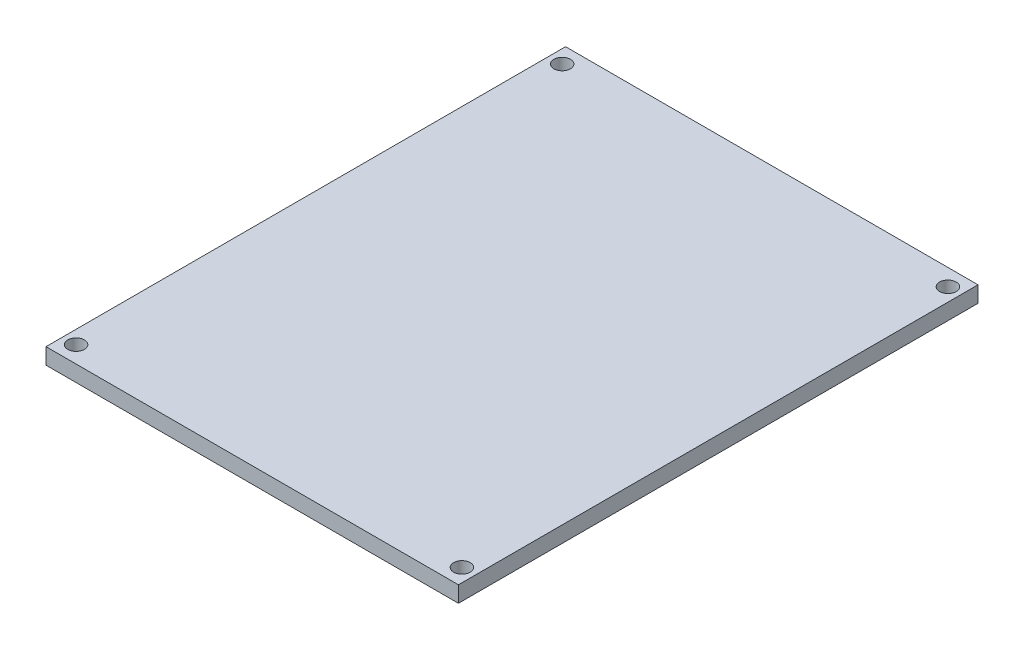
ISO-10303-21;
HEADER;
FILE_DESCRIPTION(('STEP AP214'),'2;1');
FILE_NAME('part.step','',(''),(''),'','','');
FILE_SCHEMA(('AUTOMOTIVE_DESIGN { 1 0 10303 214 1 1 1 1 }'));
ENDSEC;
DATA;
#1=APPLICATION_CONTEXT('core data for automotive mechanical design processes');
#2=APPLICATION_PROTOCOL_DEFINITION('international standard','automotive_design',2000,#1);
#3=PRODUCT_CONTEXT('',#1,'mechanical');
#4=PRODUCT('Part','Part','',(#3));
#5=PRODUCT_RELATED_PRODUCT_CATEGORY('part','',(#4));
#6=PRODUCT_DEFINITION_FORMATION('','',#4);
#7=PRODUCT_DEFINITION_CONTEXT('part definition',#1,'design');
#8=PRODUCT_DEFINITION('design','',#6,#7);
#9=PRODUCT_DEFINITION_SHAPE('','',#8);
#10=(LENGTH_UNIT() NAMED_UNIT(*) SI_UNIT(.MILLI.,.METRE.));
#11=(NAMED_UNIT(*) PLANE_ANGLE_UNIT() SI_UNIT($,.RADIAN.));
#12=(NAMED_UNIT(*) SI_UNIT($,.STERADIAN.) SOLID_ANGLE_UNIT());
#13=UNCERTAINTY_MEASURE_WITH_UNIT(LENGTH_MEASURE(1.E-05),#10,'distance_accuracy_value','');
#14=(GEOMETRIC_REPRESENTATION_CONTEXT(3) GLOBAL_UNCERTAINTY_ASSIGNED_CONTEXT((#13)) GLOBAL_UNIT_ASSIGNED_CONTEXT((#10,
#11,#12)) REPRESENTATION_CONTEXT('',''));
#15=CARTESIAN_POINT('',(0.,0.,0.));
#16=DIRECTION('',(0.,0.,1.));
#17=DIRECTION('',(1.,0.,0.));
#18=AXIS2_PLACEMENT_3D('',#15,#16,#17);
#19=CARTESIAN_POINT('',(0.,3.,0.));
#20=DIRECTION('',(0.,-1.,0.));
#21=DIRECTION('',(0.,0.,-1.));
#22=AXIS2_PLACEMENT_3D('',#19,#20,#21);
#23=PLANE('',#22);
#24=DIRECTION('',(0.,0.,1.));
#25=VECTOR('',#24,1.);
#26=CARTESIAN_POINT('',(-9.83424560929632,3.,5.64017263835992));
#27=LINE('',#26,#25);
#28=CARTESIAN_POINT('',(-9.83424560929632,3.,-91.3598273616401));
#29=VERTEX_POINT('',#28);
#30=CARTESIAN_POINT('',(-9.83424560929632,3.,5.64017263835992));
#31=VERTEX_POINT('',#30);
#32=EDGE_CURVE('E85',#29,#31,#27,.T.);
#33=ORIENTED_EDGE('',*,*,#32,.T.);
#34=DIRECTION('',(1.,0.,0.));
#35=VECTOR('',#34,1.);
#36=CARTESIAN_POINT('',(-9.83424560929632,3.,5.64017263835992));
#37=LINE('',#36,#35);
#38=CARTESIAN_POINT('',(67.1657543907037,3.,5.64017263835992));
#39=VERTEX_POINT('',#38);
#40=EDGE_CURVE('E80',#31,#39,#37,.T.);
#41=ORIENTED_EDGE('',*,*,#40,.T.);
#42=DIRECTION('',(0.,0.,-1.));
#43=VECTOR('',#42,1.);
#44=CARTESIAN_POINT('',(67.1657543907037,3.,5.64017263835992));
#45=LINE('',#44,#43);
#46=CARTESIAN_POINT('',(67.1657543907037,3.,-91.3598273616401));
#47=VERTEX_POINT('',#46);
#48=EDGE_CURVE('E83',#39,#47,#45,.T.);
#49=ORIENTED_EDGE('',*,*,#48,.T.);
#50=DIRECTION('',(-1.,0.,0.));
#51=VECTOR('',#50,1.);
#52=CARTESIAN_POINT('',(-9.83424560929632,3.,-91.3598273616401));
#53=LINE('',#52,#51);
#54=EDGE_CURVE('E50',#47,#29,#53,.T.);
#55=ORIENTED_EDGE('',*,*,#54,.T.);
#56=EDGE_LOOP('',(#33,#41,#49,#55));
#57=FACE_BOUND('',#56,.T.);
#58=CARTESIAN_POINT('',(-7.34729964129647,3.,-88.226921401952));
#59=DIRECTION('',(0.,1.,0.));
#60=DIRECTION('',(0.,0.,1.));
#61=AXIS2_PLACEMENT_3D('',#58,#59,#60);
#62=CIRCLE('',#61,1.54999999999999);
#63=CARTESIAN_POINT('',(-7.34729964129647,3.,-86.676921401952));
#64=VERTEX_POINT('',#63);
#65=EDGE_CURVE('E100',#64,#64,#62,.T.);
#66=ORIENTED_EDGE('',*,*,#65,.F.);
#67=EDGE_LOOP('',(#66));
#68=FACE_BOUND('',#67,.T.);
#69=CARTESIAN_POINT('',(64.6788084227039,3.,-88.226921401952));
#70=DIRECTION('',(0.,1.,0.));
#71=DIRECTION('',(0.,0.,1.));
#72=AXIS2_PLACEMENT_3D('',#69,#70,#71);
#73=CIRCLE('',#72,1.54999999999999);
#74=CARTESIAN_POINT('',(64.6788084227039,3.,-86.676921401952));
#75=VERTEX_POINT('',#74);
#76=EDGE_CURVE('E115',#75,#75,#73,.T.);
#77=ORIENTED_EDGE('',*,*,#76,.F.);
#78=EDGE_LOOP('',(#77));
#79=FACE_BOUND('',#78,.T.);
#80=CARTESIAN_POINT('',(-7.34729964129648,3.,2.5072666786718));
#81=DIRECTION('',(0.,1.,0.));
#82=DIRECTION('',(0.,0.,1.));
#83=AXIS2_PLACEMENT_3D('',#80,#81,#82);
#84=CIRCLE('',#83,1.55);
#85=CARTESIAN_POINT('',(-7.34729964129648,3.,4.0572666786718));
#86=VERTEX_POINT('',#85);
#87=EDGE_CURVE('E121',#86,#86,#84,.T.);
#88=ORIENTED_EDGE('',*,*,#87,.F.);
#89=EDGE_LOOP('',(#88));
#90=FACE_BOUND('',#89,.T.);
#91=CARTESIAN_POINT('',(64.6788084227038,3.,2.5072666786718));
#92=DIRECTION('',(0.,1.,0.));
#93=DIRECTION('',(0.,0.,1.));
#94=AXIS2_PLACEMENT_3D('',#91,#92,#93);
#95=CIRCLE('',#94,1.54999999999999);
#96=CARTESIAN_POINT('',(64.6788084227038,3.,4.05726667867179));
#97=VERTEX_POINT('',#96);
#98=EDGE_CURVE('E127',#97,#97,#95,.T.);
#99=ORIENTED_EDGE('',*,*,#98,.F.);
#100=EDGE_LOOP('',(#99));
#101=FACE_BOUND('',#100,.T.);
#102=ADVANCED_FACE('F33',(#57,#68,#79,#90,#101),#23,.F.);
#103=CARTESIAN_POINT('',(0.,0.,0.));
#104=DIRECTION('',(0.,-1.,0.));
#105=DIRECTION('',(0.,0.,-1.));
#106=AXIS2_PLACEMENT_3D('',#103,#104,#105);
#107=PLANE('',#106);
#108=CARTESIAN_POINT('',(-7.34729964129648,0.,2.5072666786718));
#109=DIRECTION('',(0.,1.,0.));
#110=DIRECTION('',(0.,0.,1.));
#111=AXIS2_PLACEMENT_3D('',#108,#109,#110);
#112=CIRCLE('',#111,1.55);
#113=CARTESIAN_POINT('',(-7.34729964129648,0.,4.0572666786718));
#114=VERTEX_POINT('',#113);
#115=EDGE_CURVE('E124',#114,#114,#112,.T.);
#116=ORIENTED_EDGE('',*,*,#115,.T.);
#117=EDGE_LOOP('',(#116));
#118=FACE_BOUND('',#117,.T.);
#119=CARTESIAN_POINT('',(-7.34729964129647,0.,-88.226921401952));
#120=DIRECTION('',(0.,1.,0.));
#121=DIRECTION('',(0.,0.,1.));
#122=AXIS2_PLACEMENT_3D('',#119,#120,#121);
#123=CIRCLE('',#122,1.54999999999999);
#124=CARTESIAN_POINT('',(-7.34729964129647,0.,-86.676921401952));
#125=VERTEX_POINT('',#124);
#126=EDGE_CURVE('E112',#125,#125,#123,.T.);
#127=ORIENTED_EDGE('',*,*,#126,.T.);
#128=EDGE_LOOP('',(#127));
#129=FACE_BOUND('',#128,.T.);
#130=DIRECTION('',(0.,0.,1.));
#131=VECTOR('',#130,1.);
#132=CARTESIAN_POINT('',(-9.83424560929632,0.,5.64017263835992));
#133=LINE('',#132,#131);
#134=CARTESIAN_POINT('',(-9.83424560929632,0.,-91.3598273616401));
#135=VERTEX_POINT('',#134);
#136=CARTESIAN_POINT('',(-9.83424560929632,0.,5.64017263835992));
#137=VERTEX_POINT('',#136);
#138=EDGE_CURVE('E97',#135,#137,#133,.T.);
#139=ORIENTED_EDGE('',*,*,#138,.F.);
#140=DIRECTION('',(-1.,0.,0.));
#141=VECTOR('',#140,1.);
#142=CARTESIAN_POINT('',(-9.83424560929632,0.,-91.3598273616401));
#143=LINE('',#142,#141);
#144=CARTESIAN_POINT('',(67.1657543907037,0.,-91.3598273616401));
#145=VERTEX_POINT('',#144);
#146=EDGE_CURVE('E73',#145,#135,#143,.T.);
#147=ORIENTED_EDGE('',*,*,#146,.F.);
#148=DIRECTION('',(0.,0.,-1.));
#149=VECTOR('',#148,1.);
#150=CARTESIAN_POINT('',(67.1657543907037,0.,5.64017263835992));
#151=LINE('',#150,#149);
#152=CARTESIAN_POINT('',(67.1657543907037,0.,5.64017263835992));
#153=VERTEX_POINT('',#152);
#154=EDGE_CURVE('E67',#153,#145,#151,.T.);
#155=ORIENTED_EDGE('',*,*,#154,.F.);
#156=DIRECTION('',(1.,0.,0.));
#157=VECTOR('',#156,1.);
#158=CARTESIAN_POINT('',(-9.83424560929632,0.,5.64017263835992));
#159=LINE('',#158,#157);
#160=EDGE_CURVE('E89',#137,#153,#159,.T.);
#161=ORIENTED_EDGE('',*,*,#160,.F.);
#162=EDGE_LOOP('',(#139,#147,#155,#161));
#163=FACE_BOUND('',#162,.T.);
#164=CARTESIAN_POINT('',(64.6788084227039,0.,-88.226921401952));
#165=DIRECTION('',(0.,1.,0.));
#166=DIRECTION('',(0.,0.,1.));
#167=AXIS2_PLACEMENT_3D('',#164,#165,#166);
#168=CIRCLE('',#167,1.54999999999999);
#169=CARTESIAN_POINT('',(64.6788084227039,0.,-86.676921401952));
#170=VERTEX_POINT('',#169);
#171=EDGE_CURVE('E118',#170,#170,#168,.T.);
#172=ORIENTED_EDGE('',*,*,#171,.T.);
#173=EDGE_LOOP('',(#172));
#174=FACE_BOUND('',#173,.T.);
#175=CARTESIAN_POINT('',(64.6788084227038,0.,2.5072666786718));
#176=DIRECTION('',(0.,1.,0.));
#177=DIRECTION('',(0.,0.,1.));
#178=AXIS2_PLACEMENT_3D('',#175,#176,#177);
#179=CIRCLE('',#178,1.54999999999999);
#180=CARTESIAN_POINT('',(64.6788084227038,0.,4.05726667867179));
#181=VERTEX_POINT('',#180);
#182=EDGE_CURVE('E130',#181,#181,#179,.T.);
#183=ORIENTED_EDGE('',*,*,#182,.T.);
#184=EDGE_LOOP('',(#183));
#185=FACE_BOUND('',#184,.T.);
#186=ADVANCED_FACE('F108',(#118,#129,#163,#174,#185),#107,.T.);
#187=CARTESIAN_POINT('',(-9.83424560929632,3.,5.64017263835992));
#188=DIRECTION('',(1.,0.,0.));
#189=DIRECTION('',(0.,0.,-1.));
#190=AXIS2_PLACEMENT_3D('',#187,#188,#189);
#191=PLANE('',#190);
#192=ORIENTED_EDGE('',*,*,#138,.T.);
#193=DIRECTION('',(0.,-1.,0.));
#194=VECTOR('',#193,1.);
#195=CARTESIAN_POINT('',(-9.83424560929632,3.,5.64017263835992));
#196=LINE('',#195,#194);
#197=EDGE_CURVE('E11',#31,#137,#196,.T.);
#198=ORIENTED_EDGE('',*,*,#197,.F.);
#199=ORIENTED_EDGE('',*,*,#32,.F.);
#200=DIRECTION('',(0.,-1.,0.));
#201=VECTOR('',#200,1.);
#202=CARTESIAN_POINT('',(-9.83424560929632,3.,-91.3598273616401));
#203=LINE('',#202,#201);
#204=EDGE_CURVE('E93',#29,#135,#203,.T.);
#205=ORIENTED_EDGE('',*,*,#204,.T.);
#206=EDGE_LOOP('',(#192,#198,#199,#205));
#207=FACE_BOUND('',#206,.T.);
#208=ADVANCED_FACE('F35',(#207),#191,.F.);
#209=CARTESIAN_POINT('',(-9.83424560929632,3.,5.64017263835992));
#210=DIRECTION('',(0.,0.,-1.));
#211=DIRECTION('',(-1.,0.,0.));
#212=AXIS2_PLACEMENT_3D('',#209,#210,#211);
#213=PLANE('',#212);
#214=ORIENTED_EDGE('',*,*,#160,.T.);
#215=DIRECTION('',(0.,-1.,0.));
#216=VECTOR('',#215,1.);
#217=CARTESIAN_POINT('',(67.1657543907037,3.,5.64017263835992));
#218=LINE('',#217,#216);
#219=EDGE_CURVE('E42',#39,#153,#218,.T.);
#220=ORIENTED_EDGE('',*,*,#219,.F.);
#221=ORIENTED_EDGE('',*,*,#40,.F.);
#222=ORIENTED_EDGE('',*,*,#197,.T.);
#223=EDGE_LOOP('',(#214,#220,#221,#222));
#224=FACE_BOUND('',#223,.T.);
#225=ADVANCED_FACE('F88',(#224),#213,.F.);
#226=CARTESIAN_POINT('',(67.1657543907037,3.,5.64017263835992));
#227=DIRECTION('',(-1.,0.,0.));
#228=DIRECTION('',(0.,0.,1.));
#229=AXIS2_PLACEMENT_3D('',#226,#227,#228);
#230=PLANE('',#229);
#231=ORIENTED_EDGE('',*,*,#154,.T.);
#232=DIRECTION('',(0.,-1.,0.));
#233=VECTOR('',#232,1.);
#234=CARTESIAN_POINT('',(67.1657543907037,3.,-91.3598273616401));
#235=LINE('',#234,#233);
#236=EDGE_CURVE('E90',#47,#145,#235,.T.);
#237=ORIENTED_EDGE('',*,*,#236,.F.);
#238=ORIENTED_EDGE('',*,*,#48,.F.);
#239=ORIENTED_EDGE('',*,*,#219,.T.);
#240=EDGE_LOOP('',(#231,#237,#238,#239));
#241=FACE_BOUND('',#240,.T.);
#242=ADVANCED_FACE('F91',(#241),#230,.F.);
#243=CARTESIAN_POINT('',(-9.83424560929632,3.,-91.3598273616401));
#244=DIRECTION('',(0.,0.,1.));
#245=DIRECTION('',(1.,0.,0.));
#246=AXIS2_PLACEMENT_3D('',#243,#244,#245);
#247=PLANE('',#246);
#248=ORIENTED_EDGE('',*,*,#146,.T.);
#249=ORIENTED_EDGE('',*,*,#204,.F.);
#250=ORIENTED_EDGE('',*,*,#54,.F.);
#251=ORIENTED_EDGE('',*,*,#236,.T.);
#252=EDGE_LOOP('',(#248,#249,#250,#251));
#253=FACE_BOUND('',#252,.T.);
#254=ADVANCED_FACE('F105',(#253),#247,.F.);
#255=CARTESIAN_POINT('',(-7.34729964129647,3.,-88.226921401952));
#256=DIRECTION('',(0.,-1.,0.));
#257=DIRECTION('',(0.,0.,-1.));
#258=AXIS2_PLACEMENT_3D('',#255,#256,#257);
#259=CYLINDRICAL_SURFACE('',#258,1.54999999999999);
#260=ORIENTED_EDGE('',*,*,#65,.T.);
#261=EDGE_LOOP('',(#260));
#262=FACE_BOUND('',#261,.T.);
#263=ORIENTED_EDGE('',*,*,#126,.F.);
#264=EDGE_LOOP('',(#263));
#265=FACE_BOUND('',#264,.T.);
#266=ADVANCED_FACE('F147',(#262,#265),#259,.F.);
#267=CARTESIAN_POINT('',(64.6788084227039,3.,-88.226921401952));
#268=DIRECTION('',(0.,-1.,0.));
#269=DIRECTION('',(0.,0.,-1.));
#270=AXIS2_PLACEMENT_3D('',#267,#268,#269);
#271=CYLINDRICAL_SURFACE('',#270,1.54999999999999);
#272=ORIENTED_EDGE('',*,*,#76,.T.);
#273=EDGE_LOOP('',(#272));
#274=FACE_BOUND('',#273,.T.);
#275=ORIENTED_EDGE('',*,*,#171,.F.);
#276=EDGE_LOOP('',(#275));
#277=FACE_BOUND('',#276,.T.);
#278=ADVANCED_FACE('F193',(#274,#277),#271,.F.);
#279=CARTESIAN_POINT('',(-7.34729964129648,3.,2.5072666786718));
#280=DIRECTION('',(0.,-1.,0.));
#281=DIRECTION('',(0.,0.,-1.));
#282=AXIS2_PLACEMENT_3D('',#279,#280,#281);
#283=CYLINDRICAL_SURFACE('',#282,1.55);
#284=ORIENTED_EDGE('',*,*,#87,.T.);
#285=EDGE_LOOP('',(#284));
#286=FACE_BOUND('',#285,.T.);
#287=ORIENTED_EDGE('',*,*,#115,.F.);
#288=EDGE_LOOP('',(#287));
#289=FACE_BOUND('',#288,.T.);
#290=ADVANCED_FACE('F201',(#286,#289),#283,.F.);
#291=CARTESIAN_POINT('',(64.6788084227038,3.,2.5072666786718));
#292=DIRECTION('',(0.,-1.,0.));
#293=DIRECTION('',(0.,0.,-1.));
#294=AXIS2_PLACEMENT_3D('',#291,#292,#293);
#295=CYLINDRICAL_SURFACE('',#294,1.54999999999999);
#296=ORIENTED_EDGE('',*,*,#98,.T.);
#297=EDGE_LOOP('',(#296));
#298=FACE_BOUND('',#297,.T.);
#299=ORIENTED_EDGE('',*,*,#182,.F.);
#300=EDGE_LOOP('',(#299));
#301=FACE_BOUND('',#300,.T.);
#302=ADVANCED_FACE('F136',(#298,#301),#295,.F.);
#303=CLOSED_SHELL('',(#102,#186,#208,#225,#242,#254,#266,#278,#290,#302));
#304=MANIFOLD_SOLID_BREP('B2',#303);
#305=ADVANCED_BREP_SHAPE_REPRESENTATION('',(#18,#304),#14);
#306=SHAPE_DEFINITION_REPRESENTATION(#9,#305);
ENDSEC;
END-ISO-10303-21;
